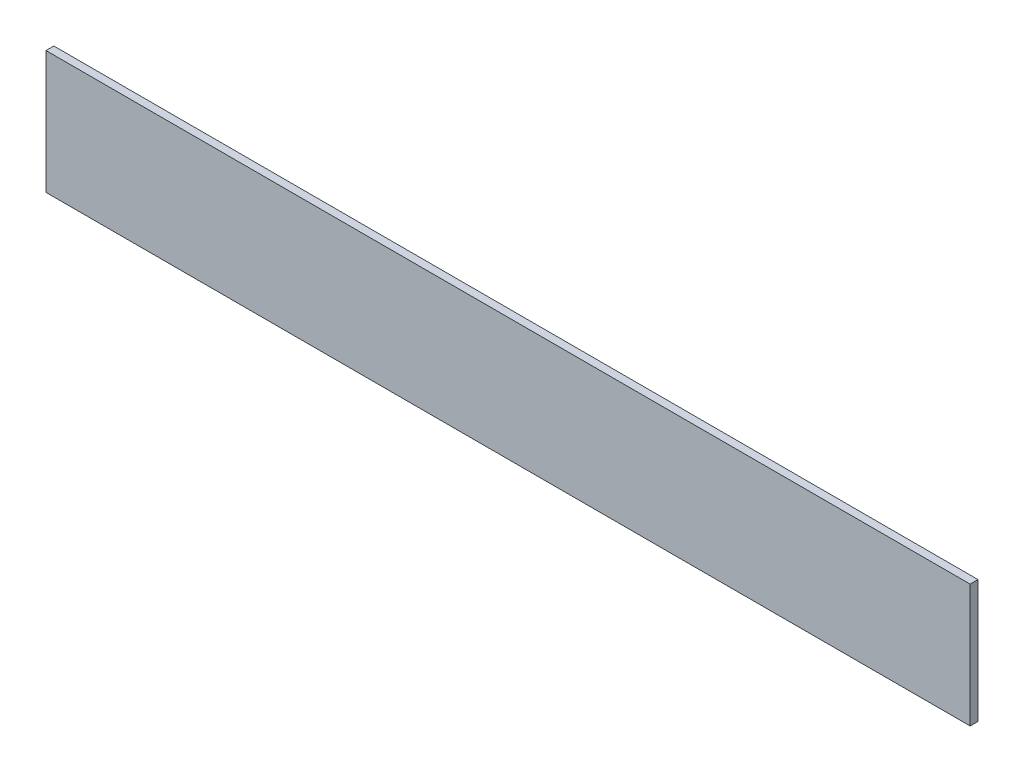
ISO-10303-21;
HEADER;
FILE_DESCRIPTION(('STEP AP214'),'2;1');
FILE_NAME('part.step','',(''),(''),'','','');
FILE_SCHEMA(('AUTOMOTIVE_DESIGN { 1 0 10303 214 1 1 1 1 }'));
ENDSEC;
DATA;
#1=APPLICATION_CONTEXT('core data for automotive mechanical design processes');
#2=APPLICATION_PROTOCOL_DEFINITION('international standard','automotive_design',2000,#1);
#3=PRODUCT_CONTEXT('',#1,'mechanical');
#4=PRODUCT('Part','Part','',(#3));
#5=PRODUCT_RELATED_PRODUCT_CATEGORY('part','',(#4));
#6=PRODUCT_DEFINITION_FORMATION('','',#4);
#7=PRODUCT_DEFINITION_CONTEXT('part definition',#1,'design');
#8=PRODUCT_DEFINITION('design','',#6,#7);
#9=PRODUCT_DEFINITION_SHAPE('','',#8);
#10=(LENGTH_UNIT() NAMED_UNIT(*) SI_UNIT(.MILLI.,.METRE.));
#11=(NAMED_UNIT(*) PLANE_ANGLE_UNIT() SI_UNIT($,.RADIAN.));
#12=(NAMED_UNIT(*) SI_UNIT($,.STERADIAN.) SOLID_ANGLE_UNIT());
#13=UNCERTAINTY_MEASURE_WITH_UNIT(LENGTH_MEASURE(1.E-05),#10,'distance_accuracy_value','');
#14=(GEOMETRIC_REPRESENTATION_CONTEXT(3) GLOBAL_UNCERTAINTY_ASSIGNED_CONTEXT((#13)) GLOBAL_UNIT_ASSIGNED_CONTEXT((#10,
#11,#12)) REPRESENTATION_CONTEXT('',''));
#15=CARTESIAN_POINT('',(0.,0.,0.));
#16=DIRECTION('',(0.,0.,1.));
#17=DIRECTION('',(1.,0.,0.));
#18=AXIS2_PLACEMENT_3D('',#15,#16,#17);
#19=CARTESIAN_POINT('',(191.032616185225,50.8,1.62348360470548));
#20=DIRECTION('',(-1.,0.,0.));
#21=DIRECTION('',(0.,0.,1.));
#22=AXIS2_PLACEMENT_3D('',#19,#20,#21);
#23=PLANE('',#22);
#24=DIRECTION('',(0.,0.,-1.));
#25=VECTOR('',#24,1.);
#26=CARTESIAN_POINT('',(191.032616185225,0.,1.62348360470548));
#27=LINE('',#26,#25);
#28=CARTESIAN_POINT('',(191.032616185225,0.,1.62348360470548));
#29=VERTEX_POINT('',#28);
#30=CARTESIAN_POINT('',(191.032616185225,0.,-1.62348360470548));
#31=VERTEX_POINT('',#30);
#32=EDGE_CURVE('E96',#29,#31,#27,.T.);
#33=ORIENTED_EDGE('',*,*,#32,.T.);
#34=DIRECTION('',(0.,-1.,0.));
#35=VECTOR('',#34,1.);
#36=CARTESIAN_POINT('',(191.032616185225,50.8,-1.62348360470548));
#37=LINE('',#36,#35);
#38=CARTESIAN_POINT('',(191.032616185225,50.8,-1.62348360470548));
#39=VERTEX_POINT('',#38);
#40=EDGE_CURVE('E11',#39,#31,#37,.T.);
#41=ORIENTED_EDGE('',*,*,#40,.F.);
#42=DIRECTION('',(0.,0.,-1.));
#43=VECTOR('',#42,1.);
#44=CARTESIAN_POINT('',(191.032616185225,50.8,1.62348360470548));
#45=LINE('',#44,#43);
#46=CARTESIAN_POINT('',(191.032616185225,50.8,1.62348360470548));
#47=VERTEX_POINT('',#46);
#48=EDGE_CURVE('E84',#47,#39,#45,.T.);
#49=ORIENTED_EDGE('',*,*,#48,.F.);
#50=DIRECTION('',(0.,-1.,0.));
#51=VECTOR('',#50,1.);
#52=CARTESIAN_POINT('',(191.032616185225,50.8,1.62348360470548));
#53=LINE('',#52,#51);
#54=EDGE_CURVE('E92',#47,#29,#53,.T.);
#55=ORIENTED_EDGE('',*,*,#54,.T.);
#56=EDGE_LOOP('',(#33,#41,#49,#55));
#57=FACE_BOUND('',#56,.T.);
#58=ADVANCED_FACE('F33',(#57),#23,.F.);
#59=CARTESIAN_POINT('',(-191.032616185225,50.8,-1.62348360470548));
#60=DIRECTION('',(0.,0.,1.));
#61=DIRECTION('',(1.,0.,0.));
#62=AXIS2_PLACEMENT_3D('',#59,#60,#61);
#63=PLANE('',#62);
#64=DIRECTION('',(-1.,0.,0.));
#65=VECTOR('',#64,1.);
#66=CARTESIAN_POINT('',(-191.032616185225,0.,-1.62348360470548));
#67=LINE('',#66,#65);
#68=CARTESIAN_POINT('',(-191.032616185225,0.,-1.62348360470548));
#69=VERTEX_POINT('',#68);
#70=EDGE_CURVE('E88',#31,#69,#67,.T.);
#71=ORIENTED_EDGE('',*,*,#70,.T.);
#72=DIRECTION('',(0.,-1.,0.));
#73=VECTOR('',#72,1.);
#74=CARTESIAN_POINT('',(-191.032616185225,50.8,-1.62348360470548));
#75=LINE('',#74,#73);
#76=CARTESIAN_POINT('',(-191.032616185225,50.8,-1.62348360470548));
#77=VERTEX_POINT('',#76);
#78=EDGE_CURVE('E41',#77,#69,#75,.T.);
#79=ORIENTED_EDGE('',*,*,#78,.F.);
#80=DIRECTION('',(-1.,0.,0.));
#81=VECTOR('',#80,1.);
#82=CARTESIAN_POINT('',(-191.032616185225,50.8,-1.62348360470548));
#83=LINE('',#82,#81);
#84=EDGE_CURVE('E79',#39,#77,#83,.T.);
#85=ORIENTED_EDGE('',*,*,#84,.F.);
#86=ORIENTED_EDGE('',*,*,#40,.T.);
#87=EDGE_LOOP('',(#71,#79,#85,#86));
#88=FACE_BOUND('',#87,.T.);
#89=ADVANCED_FACE('F87',(#88),#63,.F.);
#90=CARTESIAN_POINT('',(-191.032616185225,50.8,1.62348360470548));
#91=DIRECTION('',(1.,0.,0.));
#92=DIRECTION('',(0.,0.,-1.));
#93=AXIS2_PLACEMENT_3D('',#90,#91,#92);
#94=PLANE('',#93);
#95=DIRECTION('',(0.,0.,1.));
#96=VECTOR('',#95,1.);
#97=CARTESIAN_POINT('',(-191.032616185225,0.,1.62348360470548));
#98=LINE('',#97,#96);
#99=CARTESIAN_POINT('',(-191.032616185225,0.,1.62348360470548));
#100=VERTEX_POINT('',#99);
#101=EDGE_CURVE('E66',#69,#100,#98,.T.);
#102=ORIENTED_EDGE('',*,*,#101,.T.);
#103=DIRECTION('',(0.,-1.,0.));
#104=VECTOR('',#103,1.);
#105=CARTESIAN_POINT('',(-191.032616185225,50.8,1.62348360470548));
#106=LINE('',#105,#104);
#107=CARTESIAN_POINT('',(-191.032616185225,50.8,1.62348360470548));
#108=VERTEX_POINT('',#107);
#109=EDGE_CURVE('E89',#108,#100,#106,.T.);
#110=ORIENTED_EDGE('',*,*,#109,.F.);
#111=DIRECTION('',(0.,0.,1.));
#112=VECTOR('',#111,1.);
#113=CARTESIAN_POINT('',(-191.032616185225,50.8,1.62348360470548));
#114=LINE('',#113,#112);
#115=EDGE_CURVE('E82',#77,#108,#114,.T.);
#116=ORIENTED_EDGE('',*,*,#115,.F.);
#117=ORIENTED_EDGE('',*,*,#78,.T.);
#118=EDGE_LOOP('',(#102,#110,#116,#117));
#119=FACE_BOUND('',#118,.T.);
#120=ADVANCED_FACE('F90',(#119),#94,.F.);
#121=CARTESIAN_POINT('',(-191.032616185225,50.8,1.62348360470548));
#122=DIRECTION('',(0.,0.,-1.));
#123=DIRECTION('',(-1.,0.,0.));
#124=AXIS2_PLACEMENT_3D('',#121,#122,#123);
#125=PLANE('',#124);
#126=DIRECTION('',(1.,0.,0.));
#127=VECTOR('',#126,1.);
#128=CARTESIAN_POINT('',(-191.032616185225,0.,1.62348360470548));
#129=LINE('',#128,#127);
#130=EDGE_CURVE('E72',#100,#29,#129,.T.);
#131=ORIENTED_EDGE('',*,*,#130,.T.);
#132=ORIENTED_EDGE('',*,*,#54,.F.);
#133=DIRECTION('',(1.,0.,0.));
#134=VECTOR('',#133,1.);
#135=CARTESIAN_POINT('',(-191.032616185225,50.8,1.62348360470548));
#136=LINE('',#135,#134);
#137=EDGE_CURVE('E49',#108,#47,#136,.T.);
#138=ORIENTED_EDGE('',*,*,#137,.F.);
#139=ORIENTED_EDGE('',*,*,#109,.T.);
#140=EDGE_LOOP('',(#131,#132,#138,#139));
#141=FACE_BOUND('',#140,.T.);
#142=ADVANCED_FACE('F103',(#141),#125,.F.);
#143=CARTESIAN_POINT('',(0.,50.8,0.));
#144=DIRECTION('',(0.,-1.,0.));
#145=DIRECTION('',(0.,0.,-1.));
#146=AXIS2_PLACEMENT_3D('',#143,#144,#145);
#147=PLANE('',#146);
#148=ORIENTED_EDGE('',*,*,#48,.T.);
#149=ORIENTED_EDGE('',*,*,#84,.T.);
#150=ORIENTED_EDGE('',*,*,#115,.T.);
#151=ORIENTED_EDGE('',*,*,#137,.T.);
#152=EDGE_LOOP('',(#148,#149,#150,#151));
#153=FACE_BOUND('',#152,.T.);
#154=ADVANCED_FACE('F80',(#153),#147,.F.);
#155=CARTESIAN_POINT('',(0.,0.,0.));
#156=DIRECTION('',(0.,-1.,0.));
#157=DIRECTION('',(0.,0.,-1.));
#158=AXIS2_PLACEMENT_3D('',#155,#156,#157);
#159=PLANE('',#158);
#160=ORIENTED_EDGE('',*,*,#32,.F.);
#161=ORIENTED_EDGE('',*,*,#130,.F.);
#162=ORIENTED_EDGE('',*,*,#101,.F.);
#163=ORIENTED_EDGE('',*,*,#70,.F.);
#164=EDGE_LOOP('',(#160,#161,#162,#163));
#165=FACE_BOUND('',#164,.T.);
#166=ADVANCED_FACE('F106',(#165),#159,.T.);
#167=CLOSED_SHELL('',(#58,#89,#120,#142,#154,#166));
#168=MANIFOLD_SOLID_BREP('B2',#167);
#169=ADVANCED_BREP_SHAPE_REPRESENTATION('',(#18,#168),#14);
#170=SHAPE_DEFINITION_REPRESENTATION(#9,#169);
ENDSEC;
END-ISO-10303-21;
